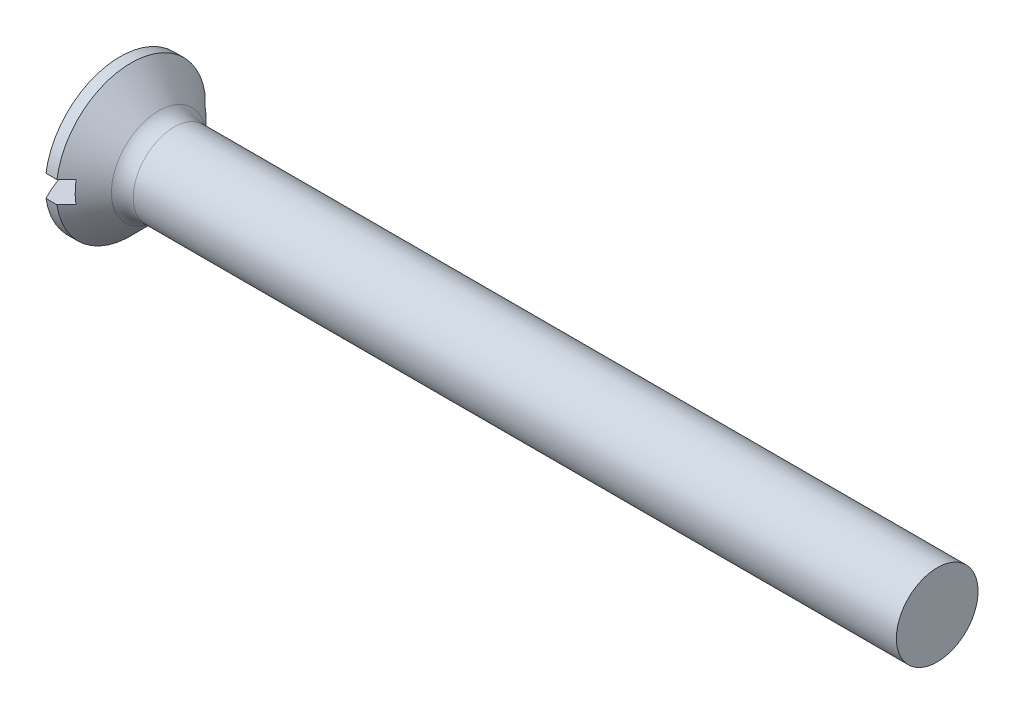
ISO-10303-21;
HEADER;
FILE_DESCRIPTION(('STEP AP214'),'2;1');
FILE_NAME('part.step','',(''),(''),'','','');
FILE_SCHEMA(('AUTOMOTIVE_DESIGN { 1 0 10303 214 1 1 1 1 }'));
ENDSEC;
DATA;
#1=APPLICATION_CONTEXT('core data for automotive mechanical design processes');
#2=APPLICATION_PROTOCOL_DEFINITION('international standard','automotive_design',2000,#1);
#3=PRODUCT_CONTEXT('',#1,'mechanical');
#4=PRODUCT('Part','Part','',(#3));
#5=PRODUCT_RELATED_PRODUCT_CATEGORY('part','',(#4));
#6=PRODUCT_DEFINITION_FORMATION('','',#4);
#7=PRODUCT_DEFINITION_CONTEXT('part definition',#1,'design');
#8=PRODUCT_DEFINITION('design','',#6,#7);
#9=PRODUCT_DEFINITION_SHAPE('','',#8);
#10=(LENGTH_UNIT() NAMED_UNIT(*) SI_UNIT(.MILLI.,.METRE.));
#11=(NAMED_UNIT(*) PLANE_ANGLE_UNIT() SI_UNIT($,.RADIAN.));
#12=(NAMED_UNIT(*) SI_UNIT($,.STERADIAN.) SOLID_ANGLE_UNIT());
#13=UNCERTAINTY_MEASURE_WITH_UNIT(LENGTH_MEASURE(1.E-05),#10,'distance_accuracy_value','');
#14=(GEOMETRIC_REPRESENTATION_CONTEXT(3) GLOBAL_UNCERTAINTY_ASSIGNED_CONTEXT((#13)) GLOBAL_UNIT_ASSIGNED_CONTEXT((#10,
#11,#12)) REPRESENTATION_CONTEXT('',''));
#15=CARTESIAN_POINT('',(0.,0.,0.));
#16=DIRECTION('',(0.,0.,1.));
#17=DIRECTION('',(1.,0.,0.));
#18=AXIS2_PLACEMENT_3D('',#15,#16,#17);
#19=CARTESIAN_POINT('',(5.75178571428571,0.,0.));
#20=DIRECTION('',(-1.,0.,0.));
#21=DIRECTION('',(0.,-1.,0.));
#22=AXIS2_PLACEMENT_3D('',#19,#20,#21);
#23=SPHERICAL_SURFACE('',#22,5.75178571428571);
#24=CARTESIAN_POINT('',(5.75178571428571,0.4,0.));
#25=DIRECTION('',(0.,1.,0.));
#26=DIRECTION('',(0.,0.,1.));
#27=AXIS2_PLACEMENT_3D('',#24,#25,#26);
#28=CIRCLE('',#27,5.73786013275518);
#29=CARTESIAN_POINT('',(0.699999999999999,0.4,2.72075357208256));
#30=VERTEX_POINT('',#29);
#31=CARTESIAN_POINT('',(0.7,0.4,-2.72075357208256));
#32=VERTEX_POINT('',#31);
#33=EDGE_CURVE('E186',#30,#32,#28,.F.);
#34=ORIENTED_EDGE('',*,*,#33,.F.);
#35=CARTESIAN_POINT('',(0.699999999999999,0.,0.));
#36=DIRECTION('',(-1.,0.,0.));
#37=DIRECTION('',(0.,0.,1.));
#38=AXIS2_PLACEMENT_3D('',#35,#36,#37);
#39=CIRCLE('',#38,2.75);
#40=EDGE_CURVE('E141',#30,#32,#39,.T.);
#41=ORIENTED_EDGE('',*,*,#40,.T.);
#42=EDGE_LOOP('',(#34,#41));
#43=FACE_BOUND('',#42,.T.);
#44=ADVANCED_FACE('F34',(#43),#23,.T.);
#45=CARTESIAN_POINT('',(-15.875,0.,0.));
#46=DIRECTION('',(-1.,0.,0.));
#47=DIRECTION('',(0.,0.,1.));
#48=AXIS2_PLACEMENT_3D('',#45,#46,#47);
#49=CYLINDRICAL_SURFACE('',#48,2.75);
#50=CARTESIAN_POINT('',(1.1,0.,0.));
#51=DIRECTION('',(-1.,0.,0.));
#52=DIRECTION('',(0.,0.,1.));
#53=AXIS2_PLACEMENT_3D('',#50,#51,#52);
#54=CIRCLE('',#53,2.75);
#55=CARTESIAN_POINT('',(1.1,0.4,2.72075357208256));
#56=VERTEX_POINT('',#55);
#57=CARTESIAN_POINT('',(1.1,0.4,-2.72075357208256));
#58=VERTEX_POINT('',#57);
#59=EDGE_CURVE('E111',#56,#58,#54,.T.);
#60=ORIENTED_EDGE('',*,*,#59,.T.);
#61=DIRECTION('',(-1.,0.,0.));
#62=VECTOR('',#61,1.);
#63=CARTESIAN_POINT('',(-15.875,0.4,-2.72075357208256));
#64=LINE('',#63,#62);
#65=EDGE_CURVE('E63',#58,#32,#64,.T.);
#66=ORIENTED_EDGE('',*,*,#65,.T.);
#67=ORIENTED_EDGE('',*,*,#40,.F.);
#68=DIRECTION('',(-1.,0.,0.));
#69=VECTOR('',#68,1.);
#70=CARTESIAN_POINT('',(-15.875,0.4,2.72075357208256));
#71=LINE('',#70,#69);
#72=EDGE_CURVE('E181',#30,#56,#71,.F.);
#73=ORIENTED_EDGE('',*,*,#72,.T.);
#74=EDGE_LOOP('',(#60,#66,#67,#73));
#75=FACE_BOUND('',#74,.T.);
#76=ADVANCED_FACE('F162',(#75),#49,.T.);
#77=CARTESIAN_POINT('',(30.7,0.,0.));
#78=DIRECTION('',(-1.,0.,0.));
#79=DIRECTION('',(0.,0.,1.));
#80=AXIS2_PLACEMENT_3D('',#77,#78,#79);
#81=PLANE('',#80);
#82=CARTESIAN_POINT('',(30.7,0.,0.));
#83=DIRECTION('',(-1.,0.,0.));
#84=DIRECTION('',(0.,0.,1.));
#85=AXIS2_PLACEMENT_3D('',#82,#83,#84);
#86=CIRCLE('',#85,1.5);
#87=CARTESIAN_POINT('',(30.7,0.,1.5));
#88=VERTEX_POINT('',#87);
#89=EDGE_CURVE('E134',#88,#88,#86,.T.);
#90=ORIENTED_EDGE('',*,*,#89,.F.);
#91=EDGE_LOOP('',(#90));
#92=FACE_BOUND('',#91,.T.);
#93=ADVANCED_FACE('F170',(#92),#81,.F.);
#94=CARTESIAN_POINT('',(5.75178571428571,-0.4,0.));
#95=DIRECTION('',(0.,-1.,0.));
#96=DIRECTION('',(0.,0.,-1.));
#97=AXIS2_PLACEMENT_3D('',#94,#95,#96);
#98=CIRCLE('',#97,5.73786013275518);
#99=CARTESIAN_POINT('',(0.699999999999999,-0.399999999999999,-2.72075357208256));
#100=VERTEX_POINT('',#99);
#101=CARTESIAN_POINT('',(0.7,-0.4,2.72075357208256));
#102=VERTEX_POINT('',#101);
#103=EDGE_CURVE('E132',#100,#102,#98,.F.);
#104=ORIENTED_EDGE('',*,*,#103,.F.);
#105=EDGE_CURVE('E131',#100,#102,#39,.T.);
#106=ORIENTED_EDGE('',*,*,#105,.T.);
#107=EDGE_LOOP('',(#104,#106));
#108=FACE_BOUND('',#107,.T.);
#109=ADVANCED_FACE('F160',(#108),#23,.T.);
#110=CARTESIAN_POINT('',(1.1,-0.399999999999999,-2.72075357208256));
#111=VERTEX_POINT('',#110);
#112=CARTESIAN_POINT('',(1.1,-0.4,2.72075357208256));
#113=VERTEX_POINT('',#112);
#114=EDGE_CURVE('E129',#111,#113,#54,.T.);
#115=ORIENTED_EDGE('',*,*,#114,.T.);
#116=DIRECTION('',(-1.,0.,0.));
#117=VECTOR('',#116,1.);
#118=CARTESIAN_POINT('',(-15.875,-0.4,2.72075357208256));
#119=LINE('',#118,#117);
#120=EDGE_CURVE('E179',#113,#102,#119,.T.);
#121=ORIENTED_EDGE('',*,*,#120,.T.);
#122=ORIENTED_EDGE('',*,*,#105,.F.);
#123=DIRECTION('',(-1.,0.,0.));
#124=VECTOR('',#123,1.);
#125=CARTESIAN_POINT('',(-15.875,-0.399999999999999,-2.72075357208256));
#126=LINE('',#125,#124);
#127=EDGE_CURVE('E121',#100,#111,#126,.F.);
#128=ORIENTED_EDGE('',*,*,#127,.T.);
#129=EDGE_LOOP('',(#115,#121,#122,#128));
#130=FACE_BOUND('',#129,.T.);
#131=ADVANCED_FACE('F127',(#130),#49,.T.);
#132=CARTESIAN_POINT('',(1.1,0.,0.));
#133=DIRECTION('',(-1.,0.,0.));
#134=DIRECTION('',(0.,0.,1.));
#135=AXIS2_PLACEMENT_3D('',#132,#133,#134);
#136=CONICAL_SURFACE('',#135,2.75,0.785398163397451);
#137=CARTESIAN_POINT('',(-2.20687506719363,0.4,-6.04365250321294));
#138=CARTESIAN_POINT('',(-1.99911791295739,0.4,-5.83543706816867));
#139=CARTESIAN_POINT('',(-1.79138070694893,0.4,-5.62720171024495));
#140=CARTESIAN_POINT('',(-1.37596790952366,0.4,-5.21066089973354));
#141=CARTESIAN_POINT('',(-1.16829231947987,0.4,-5.00235544577663));
#142=CARTESIAN_POINT('',(-0.752935195563242,0.4,-4.58555459209981));
#143=CARTESIAN_POINT('',(-0.545253705087103,0.4,-4.37705914913036));
#144=CARTESIAN_POINT('',(-0.130034329894829,0.4,-3.95993369416348));
#145=CARTESIAN_POINT('',(0.0775035576502772,0.4,-3.75130368498304));
#146=CARTESIAN_POINT('',(0.494407781570427,0.4,-3.33174989266189));
#147=CARTESIAN_POINT('',(0.703771859093169,0.4,-3.12082386486281));
#148=CARTESIAN_POINT('',(1.1221115595338,0.4,-2.6985614653926));
#149=CARTESIAN_POINT('',(1.33108715855867,0.4,-2.4872250700166));
#150=CARTESIAN_POINT('',(1.64388389817989,0.4,-2.16962535790698));
#151=CARTESIAN_POINT('',(1.74802293864373,0.4,-2.06367539317932));
#152=CARTESIAN_POINT('',(1.95596336871291,0.4,-1.85143960284149));
#153=CARTESIAN_POINT('',(2.05976475015577,0.4,-1.74515376923276));
#154=CARTESIAN_POINT('',(2.26679924709425,0.4,-1.53205090253776));
#155=CARTESIAN_POINT('',(2.37003242409393,0.4,-1.42523392942454));
#156=CARTESIAN_POINT('',(2.52407725733261,0.4,-1.26424160334649));
#157=CARTESIAN_POINT('',(2.57529039162473,0.4,-1.2104507370719));
#158=CARTESIAN_POINT('',(2.67732003987691,0.4,-1.10249450654719));
#159=CARTESIAN_POINT('',(2.72813655943352,0.4,-1.04832914760188));
#160=CARTESIAN_POINT('',(2.80606903249431,0.4,-0.964319491962321));
#161=CARTESIAN_POINT('',(2.83340075004673,0.4,-0.934675525328245));
#162=CARTESIAN_POINT('',(2.88782717855192,0.4,-0.875169471385721));
#163=CARTESIAN_POINT('',(2.91492188422776,0.4,-0.845307379247869));
#164=CARTESIAN_POINT('',(2.96879557439535,0.4,-0.785300565667673));
#165=CARTESIAN_POINT('',(2.99557457122911,0.4,-0.755155855356987));
#166=CARTESIAN_POINT('',(3.04869127920293,0.4,-0.694483953277073));
#167=CARTESIAN_POINT('',(3.07502901037372,0.4,-0.663956778979876));
#168=CARTESIAN_POINT('',(3.14025169732398,0.4,-0.586831686163971));
#169=CARTESIAN_POINT('',(3.17875545873879,0.4,-0.539904035770369));
#170=CARTESIAN_POINT('',(3.23456130499465,0.4,-0.467961902417087));
#171=CARTESIAN_POINT('',(3.2528450561914,0.4,-0.443712961554713));
#172=CARTESIAN_POINT('',(3.28843817843407,0.4,-0.394514061786016));
#173=CARTESIAN_POINT('',(3.30574783007905,0.4,-0.369564307892625));
#174=CARTESIAN_POINT('',(3.34204525545067,0.4,-0.313922402752045));
#175=CARTESIAN_POINT('',(3.3607358202328,0.4,-0.283033185985472));
#176=CARTESIAN_POINT('',(3.39460504959263,0.4,-0.219342045744408));
#177=CARTESIAN_POINT('',(3.40978976390098,0.4,-0.186543541327947));
#178=CARTESIAN_POINT('',(3.43021151429552,0.4,-0.129208992664752));
#179=CARTESIAN_POINT('',(3.43707356135638,0.4,-0.1052747555798));
#180=CARTESIAN_POINT('',(3.4467071154564,0.4,-0.0566326947192364));
#181=CARTESIAN_POINT('',(3.4494928891363,0.4,-0.0319278795646281));
#182=CARTESIAN_POINT('',(3.45038049815129,0.4,0.01769409627909));
#183=CARTESIAN_POINT('',(3.44845909398932,0.4,0.0426117028461645));
#184=CARTESIAN_POINT('',(3.44033462081573,0.4,0.0917596818483822));
#185=CARTESIAN_POINT('',(3.43412006061589,0.4,0.115988027737382));
#186=CARTESIAN_POINT('',(3.41821974273151,0.4,0.164241751340461));
#187=CARTESIAN_POINT('',(3.40841190078598,0.4,0.188225005941296));
#188=CARTESIAN_POINT('',(3.38647762256258,0.4,0.235124707114329));
#189=CARTESIAN_POINT('',(3.37434697115714,0.4,0.25803911860878));
#190=CARTESIAN_POINT('',(3.34844412191649,0.4,0.303153601702645));
#191=CARTESIAN_POINT('',(3.33465931069166,0.4,0.325346298833452));
#192=CARTESIAN_POINT('',(3.30603668503229,0.4,0.369005903107238));
#193=CARTESIAN_POINT('',(3.29119978282362,0.4,0.390473415747056));
#194=CARTESIAN_POINT('',(3.24296344555379,0.4,0.457755220036411));
#195=CARTESIAN_POINT('',(3.20820599347253,0.4,0.502588412328846));
#196=CARTESIAN_POINT('',(3.13694507139463,0.4,0.590853682125024));
#197=CARTESIAN_POINT('',(3.10044047197261,0.4,0.634284822066959));
#198=CARTESIAN_POINT('',(3.02634037753114,0.4,0.72034372400483));
#199=CARTESIAN_POINT('',(2.98874300765707,0.4,0.762969869602556));
#200=CARTESIAN_POINT('',(2.91291592831249,0.4,0.847629579609178));
#201=CARTESIAN_POINT('',(2.87468640684535,0.4,0.889663313551345));
#202=CARTESIAN_POINT('',(2.75959651924668,0.4,1.01492951206666));
#203=CARTESIAN_POINT('',(2.68210812929095,0.4,1.09758392829678));
#204=CARTESIAN_POINT('',(2.52637558207674,0.4,1.26200363451888));
#205=CARTESIAN_POINT('',(2.44813232292424,0.4,1.3437697818001));
#206=CARTESIAN_POINT('',(2.29151509510833,0.4,1.50643852816011));
#207=CARTESIAN_POINT('',(2.21314346542554,0.4,1.58734337928877));
#208=CARTESIAN_POINT('',(2.05608715943505,0.4,1.74884883720659));
#209=CARTESIAN_POINT('',(1.9774024816494,0.4,1.82944944255585));
#210=CARTESIAN_POINT('',(1.74103566842241,0.4,2.07095119311855));
#211=CARTESIAN_POINT('',(1.58304383254662,0.4,2.23154909405024));
#212=CARTESIAN_POINT('',(1.26657499486531,0.4,2.55240298553707));
#213=CARTESIAN_POINT('',(1.10809781212863,0.4,2.71265879727663));
#214=CARTESIAN_POINT('',(0.790894688876724,0.4,3.03292106932726));
#215=CARTESIAN_POINT('',(0.632168750700918,0.4,3.19292753195542));
#216=CARTESIAN_POINT('',(0.155783351799242,0.4,3.67269610034974));
#217=CARTESIAN_POINT('',(-0.162105949218516,0.4,3.99222988669735));
#218=CARTESIAN_POINT('',(-0.798134188738941,0.4,4.63098060937499));
#219=CARTESIAN_POINT('',(-1.11627309687817,0.4,4.95019757595958));
#220=CARTESIAN_POINT('',(-1.56320218978181,0.4,5.39841195425101));
#221=CARTESIAN_POINT('',(-1.69192414545276,0.4,5.52747740064136));
#222=CARTESIAN_POINT('',(-1.94938617914345,0.4,5.78558230402052));
#223=CARTESIAN_POINT('',(-2.07812625648468,0.4,5.91462176168614));
#224=CARTESIAN_POINT('',(-2.20687506719363,0.4,6.04365250321294));
#225=B_SPLINE_CURVE_WITH_KNOTS('',3,(#137,#138,#139,#140,#141,#142,#143,#144,#145,#146,#147,
#148,#149,#150,#151,#152,#153,#154,#155,#156,#157,#158,#159,#160,#161,#162,#163,#164,#165,#166,
#167,#168,#169,#170,#171,#172,#173,#174,#175,#176,#177,#178,#179,#180,#181,#182,#183,#184,#185,
#186,#187,#188,#189,#190,#191,#192,#193,#194,#195,#196,#197,#198,#199,#200,#201,#202,#203,#204,
#205,#206,#207,#208,#209,#210,#211,#212,#213,#214,#215,#216,#217,#218,#219,#220,#221,#222,#223,
#224),.UNSPECIFIED.,.F.,.F.,(4,2,2,2,2,2,2,2,2,2,2,2,2,2,2,2,2,2,2,2,2,2,2,2,2,2,2,2,2,2,2,2,2,
2,2,2,2,2,2,2,2,2,2,4),(0.,0.882411670998369,1.76484171556896,2.64768796704174,3.53051630092899,
4.42209225744861,5.31372134637069,5.7594034191722,6.20509618690235,6.65073972348625,
6.87355282619033,7.09636277912197,7.21732492922553,7.33828976565757,7.45924985742287,
7.58020444339417,7.76224766050512,7.85334054485994,7.94440705325149,8.05261108892279,
8.16062698732483,8.23505770146545,8.30922728557388,8.38376378469999,8.45850056736451,
8.53605624120453,8.61375400995255,8.692087197356,8.77035327665499,8.9404317779459,
9.11062175021445,9.28112330630674,9.45157503568536,9.79145073140556,10.1309624951667,
10.4688800231388,10.806799148381,11.4826506760623,12.158795771663,12.8349345461951,
14.1871171522788,15.5391550207073,16.0860051634555,16.6328385004407),.UNSPECIFIED.);
#226=CARTESIAN_POINT('',(1.45,0.4,-2.36643191323985));
#227=VERTEX_POINT('',#226);
#228=EDGE_CURVE('E11',#58,#227,#225,.T.);
#229=ORIENTED_EDGE('',*,*,#228,.F.);
#230=ORIENTED_EDGE('',*,*,#59,.F.);
#231=CARTESIAN_POINT('',(1.45,0.4,2.36643191323985));
#232=VERTEX_POINT('',#231);
#233=EDGE_CURVE('E38',#232,#56,#225,.T.);
#234=ORIENTED_EDGE('',*,*,#233,.F.);
#235=CARTESIAN_POINT('',(1.45,0.,0.));
#236=DIRECTION('',(-1.,0.,0.));
#237=DIRECTION('',(0.,0.,1.));
#238=AXIS2_PLACEMENT_3D('',#235,#236,#237);
#239=CIRCLE('',#238,2.4);
#240=CARTESIAN_POINT('',(1.45,-0.4,2.36643191323985));
#241=VERTEX_POINT('',#240);
#242=EDGE_CURVE('E92',#232,#241,#239,.F.);
#243=ORIENTED_EDGE('',*,*,#242,.T.);
#244=CARTESIAN_POINT('',(-2.20687506719363,-0.4,6.04365250321294));
#245=CARTESIAN_POINT('',(-1.99911791295739,-0.4,5.83543706816868));
#246=CARTESIAN_POINT('',(-1.79138070694893,-0.4,5.62720171024495));
#247=CARTESIAN_POINT('',(-1.37596790952366,-0.4,5.21066089973354));
#248=CARTESIAN_POINT('',(-1.16829231947986,-0.4,5.00235544577663));
#249=CARTESIAN_POINT('',(-0.752935195563239,-0.4,4.58555459209981));
#250=CARTESIAN_POINT('',(-0.545253705087099,-0.4,4.37705914913036));
#251=CARTESIAN_POINT('',(-0.130034329894824,-0.4,3.95993369416348));
#252=CARTESIAN_POINT('',(0.0775035576502829,-0.4,3.75130368498303));
#253=CARTESIAN_POINT('',(0.494407781570432,-0.4,3.33174989266188));
#254=CARTESIAN_POINT('',(0.703771859093174,-0.4,3.12082386486281));
#255=CARTESIAN_POINT('',(1.12211155953381,-0.4,2.6985614653926));
#256=CARTESIAN_POINT('',(1.33108715855867,-0.4,2.4872250700166));
#257=CARTESIAN_POINT('',(1.64388389817989,-0.4,2.16962535790698));
#258=CARTESIAN_POINT('',(1.74802293864373,-0.4,2.06367539317931));
#259=CARTESIAN_POINT('',(1.95596336871291,-0.4,1.85143960284149));
#260=CARTESIAN_POINT('',(2.05976475015577,-0.4,1.74515376923276));
#261=CARTESIAN_POINT('',(2.26679924709425,-0.4,1.53205090253776));
#262=CARTESIAN_POINT('',(2.37003242409393,-0.4,1.42523392942454));
#263=CARTESIAN_POINT('',(2.52407725733261,-0.4,1.26424160334649));
#264=CARTESIAN_POINT('',(2.57529039162473,-0.4,1.2104507370719));
#265=CARTESIAN_POINT('',(2.67732003987691,-0.4,1.10249450654719));
#266=CARTESIAN_POINT('',(2.72813655943352,-0.4,1.04832914760188));
#267=CARTESIAN_POINT('',(2.80606903249431,-0.4,0.964319491962322));
#268=CARTESIAN_POINT('',(2.83340075004673,-0.4,0.934675525328246));
#269=CARTESIAN_POINT('',(2.88782717855192,-0.4,0.875169471385722));
#270=CARTESIAN_POINT('',(2.91492188422776,-0.4,0.84530737924787));
#271=CARTESIAN_POINT('',(2.96879557439535,-0.4,0.785300565667673));
#272=CARTESIAN_POINT('',(2.99557457122911,-0.4,0.755155855356988));
#273=CARTESIAN_POINT('',(3.04869127920293,-0.4,0.694483953277073));
#274=CARTESIAN_POINT('',(3.07502901037372,-0.4,0.663956778979877));
#275=CARTESIAN_POINT('',(3.14025169732398,-0.4,0.586831686163971));
#276=CARTESIAN_POINT('',(3.17875545873879,-0.4,0.53990403577037));
#277=CARTESIAN_POINT('',(3.23456130499465,-0.4,0.467961902417087));
#278=CARTESIAN_POINT('',(3.2528450561914,-0.4,0.443712961554713));
#279=CARTESIAN_POINT('',(3.28843817843407,-0.4,0.394514061786016));
#280=CARTESIAN_POINT('',(3.30574783007905,-0.4,0.369564307892625));
#281=CARTESIAN_POINT('',(3.34204525545067,-0.4,0.313922402752045));
#282=CARTESIAN_POINT('',(3.3607358202328,-0.4,0.283033185985472));
#283=CARTESIAN_POINT('',(3.39460504959263,-0.4,0.219342045744408));
#284=CARTESIAN_POINT('',(3.40978976390098,-0.4,0.186543541327946));
#285=CARTESIAN_POINT('',(3.43021151429552,-0.4,0.129208992664752));
#286=CARTESIAN_POINT('',(3.43707356135638,-0.4,0.1052747555798));
#287=CARTESIAN_POINT('',(3.4467071154564,-0.4,0.0566326947192364));
#288=CARTESIAN_POINT('',(3.4494928891363,-0.4,0.0319278795646281));
#289=CARTESIAN_POINT('',(3.45038049815129,-0.4,-0.0176940962790904));
#290=CARTESIAN_POINT('',(3.44845909398933,-0.4,-0.0426117028461655));
#291=CARTESIAN_POINT('',(3.44033462081573,-0.4,-0.0917596818483832));
#292=CARTESIAN_POINT('',(3.43412006061589,-0.4,-0.115988027737382));
#293=CARTESIAN_POINT('',(3.41821974273151,-0.4,-0.16424175134046));
#294=CARTESIAN_POINT('',(3.40841190078598,-0.4,-0.188225005941296));
#295=CARTESIAN_POINT('',(3.38647762256258,-0.4,-0.235124707114328));
#296=CARTESIAN_POINT('',(3.37434697115714,-0.4,-0.258039118608779));
#297=CARTESIAN_POINT('',(3.34844412191649,-0.4,-0.303153601702646));
#298=CARTESIAN_POINT('',(3.33465931069166,-0.4,-0.325346298833453));
#299=CARTESIAN_POINT('',(3.30603668503229,-0.4,-0.369005903107239));
#300=CARTESIAN_POINT('',(3.29119978282362,-0.4,-0.390473415747057));
#301=CARTESIAN_POINT('',(3.24296344555379,-0.4,-0.457755220036411));
#302=CARTESIAN_POINT('',(3.20820599347253,-0.4,-0.502588412328846));
#303=CARTESIAN_POINT('',(3.13694507139463,-0.4,-0.590853682125023));
#304=CARTESIAN_POINT('',(3.10044047197261,-0.4,-0.634284822066957));
#305=CARTESIAN_POINT('',(3.02634037753114,-0.4,-0.720343724004828));
#306=CARTESIAN_POINT('',(2.98874300765707,-0.4,-0.762969869602555));
#307=CARTESIAN_POINT('',(2.91291592831249,-0.4,-0.847629579609176));
#308=CARTESIAN_POINT('',(2.87468640684535,-0.4,-0.889663313551344));
#309=CARTESIAN_POINT('',(2.75959651924668,-0.399999999999999,-1.01492951206666));
#310=CARTESIAN_POINT('',(2.68210812929095,-0.4,-1.09758392829677));
#311=CARTESIAN_POINT('',(2.52637558207674,-0.4,-1.26200363451888));
#312=CARTESIAN_POINT('',(2.44813232292424,-0.399999999999999,-1.3437697818001));
#313=CARTESIAN_POINT('',(2.29151509510833,-0.399999999999999,-1.50643852816011));
#314=CARTESIAN_POINT('',(2.21314346542554,-0.399999999999999,-1.58734337928877));
#315=CARTESIAN_POINT('',(2.05608715943505,-0.399999999999999,-1.74884883720659));
#316=CARTESIAN_POINT('',(1.9774024816494,-0.399999999999999,-1.82944944255585));
#317=CARTESIAN_POINT('',(1.74103566842241,-0.399999999999999,-2.07095119311855));
#318=CARTESIAN_POINT('',(1.58304383254662,-0.399999999999999,-2.23154909405024));
#319=CARTESIAN_POINT('',(1.26657499486531,-0.399999999999999,-2.55240298553707));
#320=CARTESIAN_POINT('',(1.10809781212863,-0.399999999999999,-2.71265879727663));
#321=CARTESIAN_POINT('',(0.790894688876725,-0.399999999999999,-3.03292106932726));
#322=CARTESIAN_POINT('',(0.632168750700919,-0.399999999999999,-3.19292753195542));
#323=CARTESIAN_POINT('',(0.155783351799241,-0.399999999999999,-3.67269610034974));
#324=CARTESIAN_POINT('',(-0.162105949218516,-0.399999999999999,-3.99222988669735));
#325=CARTESIAN_POINT('',(-0.798134188738942,-0.399999999999999,-4.63098060937499));
#326=CARTESIAN_POINT('',(-1.11627309687817,-0.399999999999999,-4.95019757595958));
#327=CARTESIAN_POINT('',(-1.56320218978181,-0.399999999999999,-5.39841195425101));
#328=CARTESIAN_POINT('',(-1.69192414545276,-0.399999999999999,-5.52747740064136));
#329=CARTESIAN_POINT('',(-1.94938617914345,-0.399999999999999,-5.78558230402052));
#330=CARTESIAN_POINT('',(-2.07812625648468,-0.399999999999999,-5.91462176168614));
#331=CARTESIAN_POINT('',(-2.20687506719363,-0.399999999999999,-6.04365250321294));
#332=B_SPLINE_CURVE_WITH_KNOTS('',3,(#244,#245,#246,#247,#248,#249,#250,#251,#252,#253,#254,
#255,#256,#257,#258,#259,#260,#261,#262,#263,#264,#265,#266,#267,#268,#269,#270,#271,#272,#273,
#274,#275,#276,#277,#278,#279,#280,#281,#282,#283,#284,#285,#286,#287,#288,#289,#290,#291,#292,
#293,#294,#295,#296,#297,#298,#299,#300,#301,#302,#303,#304,#305,#306,#307,#308,#309,#310,#311,
#312,#313,#314,#315,#316,#317,#318,#319,#320,#321,#322,#323,#324,#325,#326,#327,#328,#329,#330,
#331),.UNSPECIFIED.,.F.,.F.,(4,2,2,2,2,2,2,2,2,2,2,2,2,2,2,2,2,2,2,2,2,2,2,2,2,2,2,2,2,2,2,2,2,
2,2,2,2,2,2,2,2,2,2,4),(0.,0.882411670998371,1.76484171556897,2.64768796704175,3.530516300929,
4.42209225744862,5.31372134637069,5.75940341917221,6.20509618690235,6.65073972348625,
6.87355282619033,7.09636277912197,7.21732492922553,7.33828976565758,7.45924985742287,
7.58020444339417,7.76224766050512,7.85334054485994,7.94440705325149,8.05261108892279,
8.16062698732483,8.23505770146545,8.30922728557388,8.38376378469999,8.45850056736452,
8.53605624120453,8.61375400995255,8.692087197356,8.77035327665499,8.9404317779459,
9.11062175021445,9.28112330630674,9.45157503568536,9.79145073140556,10.1309624951667,
10.4688800231388,10.806799148381,11.4826506760623,12.158795771663,12.8349345461951,
14.1871171522788,15.5391550207073,16.0860051634555,16.6328385004407),.UNSPECIFIED.);
#333=EDGE_CURVE('E100',#113,#241,#332,.T.);
#334=ORIENTED_EDGE('',*,*,#333,.F.);
#335=ORIENTED_EDGE('',*,*,#114,.F.);
#336=CARTESIAN_POINT('',(1.45,-0.399999999999999,-2.36643191323985));
#337=VERTEX_POINT('',#336);
#338=EDGE_CURVE('E49',#337,#111,#332,.T.);
#339=ORIENTED_EDGE('',*,*,#338,.F.);
#340=EDGE_CURVE('E103',#337,#227,#239,.F.);
#341=ORIENTED_EDGE('',*,*,#340,.T.);
#342=EDGE_LOOP('',(#229,#230,#234,#243,#334,#335,#339,#341));
#343=FACE_BOUND('',#342,.T.);
#344=CARTESIAN_POINT('',(2.11568542494923,0.,0.));
#345=DIRECTION('',(1.,0.,0.));
#346=DIRECTION('',(0.,0.,-1.));
#347=AXIS2_PLACEMENT_3D('',#344,#345,#346);
#348=CIRCLE('',#347,1.73431457505076);
#349=CARTESIAN_POINT('',(2.11568542494923,0.,-1.73431457505076));
#350=VERTEX_POINT('',#349);
#351=EDGE_CURVE('E142',#350,#350,#348,.F.);
#352=ORIENTED_EDGE('',*,*,#351,.T.);
#353=EDGE_LOOP('',(#352));
#354=FACE_BOUND('',#353,.T.);
#355=ADVANCED_FACE('F108',(#343,#354),#136,.T.);
#356=CARTESIAN_POINT('',(-15.875,0.,0.));
#357=DIRECTION('',(-1.,0.,0.));
#358=DIRECTION('',(0.,0.,1.));
#359=AXIS2_PLACEMENT_3D('',#356,#357,#358);
#360=CYLINDRICAL_SURFACE('',#359,1.5);
#361=CARTESIAN_POINT('',(2.68137084989847,0.,0.));
#362=DIRECTION('',(-1.,0.,0.));
#363=DIRECTION('',(0.,0.,1.));
#364=AXIS2_PLACEMENT_3D('',#361,#362,#363);
#365=CIRCLE('',#364,1.5);
#366=CARTESIAN_POINT('',(2.68137084989847,0.,1.5));
#367=VERTEX_POINT('',#366);
#368=EDGE_CURVE('E101',#367,#367,#365,.F.);
#369=ORIENTED_EDGE('',*,*,#368,.T.);
#370=EDGE_LOOP('',(#369));
#371=FACE_BOUND('',#370,.T.);
#372=ORIENTED_EDGE('',*,*,#89,.T.);
#373=EDGE_LOOP('',(#372));
#374=FACE_BOUND('',#373,.T.);
#375=ADVANCED_FACE('F148',(#371,#374),#360,.T.);
#376=CARTESIAN_POINT('',(2.68137084989847,0.,0.));
#377=DIRECTION('',(-1.,0.,0.));
#378=DIRECTION('',(0.,0.,1.));
#379=AXIS2_PLACEMENT_3D('',#376,#377,#378);
#380=TOROIDAL_SURFACE('',#379,2.3,0.8);
#381=ORIENTED_EDGE('',*,*,#368,.F.);
#382=EDGE_LOOP('',(#381));
#383=FACE_BOUND('',#382,.T.);
#384=ORIENTED_EDGE('',*,*,#351,.F.);
#385=EDGE_LOOP('',(#384));
#386=FACE_BOUND('',#385,.T.);
#387=ADVANCED_FACE('F36',(#383,#386),#380,.F.);
#388=CARTESIAN_POINT('',(1.45,0.4,2.75));
#389=DIRECTION('',(0.,1.,0.));
#390=DIRECTION('',(0.,0.,1.));
#391=AXIS2_PLACEMENT_3D('',#388,#389,#390);
#392=PLANE('',#391);
#393=ORIENTED_EDGE('',*,*,#228,.T.);
#394=DIRECTION('',(0.,0.,-1.));
#395=VECTOR('',#394,1.);
#396=CARTESIAN_POINT('',(1.45,0.4,2.75));
#397=LINE('',#396,#395);
#398=EDGE_CURVE('E95',#232,#227,#397,.T.);
#399=ORIENTED_EDGE('',*,*,#398,.F.);
#400=ORIENTED_EDGE('',*,*,#233,.T.);
#401=ORIENTED_EDGE('',*,*,#72,.F.);
#402=ORIENTED_EDGE('',*,*,#33,.T.);
#403=ORIENTED_EDGE('',*,*,#65,.F.);
#404=EDGE_LOOP('',(#393,#399,#400,#401,#402,#403));
#405=FACE_BOUND('',#404,.T.);
#406=ADVANCED_FACE('F104',(#405),#392,.F.);
#407=CARTESIAN_POINT('',(1.45,-0.399999999999999,-2.75));
#408=DIRECTION('',(0.,-1.,0.));
#409=DIRECTION('',(0.,0.,-1.));
#410=AXIS2_PLACEMENT_3D('',#407,#408,#409);
#411=PLANE('',#410);
#412=ORIENTED_EDGE('',*,*,#333,.T.);
#413=DIRECTION('',(0.,0.,1.));
#414=VECTOR('',#413,1.);
#415=CARTESIAN_POINT('',(1.45,-0.399999999999999,-2.75));
#416=LINE('',#415,#414);
#417=EDGE_CURVE('E56',#337,#241,#416,.T.);
#418=ORIENTED_EDGE('',*,*,#417,.F.);
#419=ORIENTED_EDGE('',*,*,#338,.T.);
#420=ORIENTED_EDGE('',*,*,#127,.F.);
#421=ORIENTED_EDGE('',*,*,#103,.T.);
#422=ORIENTED_EDGE('',*,*,#120,.F.);
#423=EDGE_LOOP('',(#412,#418,#419,#420,#421,#422));
#424=FACE_BOUND('',#423,.T.);
#425=ADVANCED_FACE('F120',(#424),#411,.F.);
#426=CARTESIAN_POINT('',(1.45,0.4,-2.75));
#427=DIRECTION('',(-1.,0.,0.));
#428=DIRECTION('',(0.,0.,1.));
#429=AXIS2_PLACEMENT_3D('',#426,#427,#428);
#430=PLANE('',#429);
#431=ORIENTED_EDGE('',*,*,#417,.T.);
#432=ORIENTED_EDGE('',*,*,#242,.F.);
#433=ORIENTED_EDGE('',*,*,#398,.T.);
#434=ORIENTED_EDGE('',*,*,#340,.F.);
#435=EDGE_LOOP('',(#431,#432,#433,#434));
#436=FACE_BOUND('',#435,.T.);
#437=ADVANCED_FACE('F94',(#436),#430,.T.);
#438=CLOSED_SHELL('',(#44,#76,#93,#109,#131,#355,#375,#387,#406,#425,#437));
#439=MANIFOLD_SOLID_BREP('B2',#438);
#440=ADVANCED_BREP_SHAPE_REPRESENTATION('',(#18,#439),#14);
#441=SHAPE_DEFINITION_REPRESENTATION(#9,#440);
ENDSEC;
END-ISO-10303-21;
